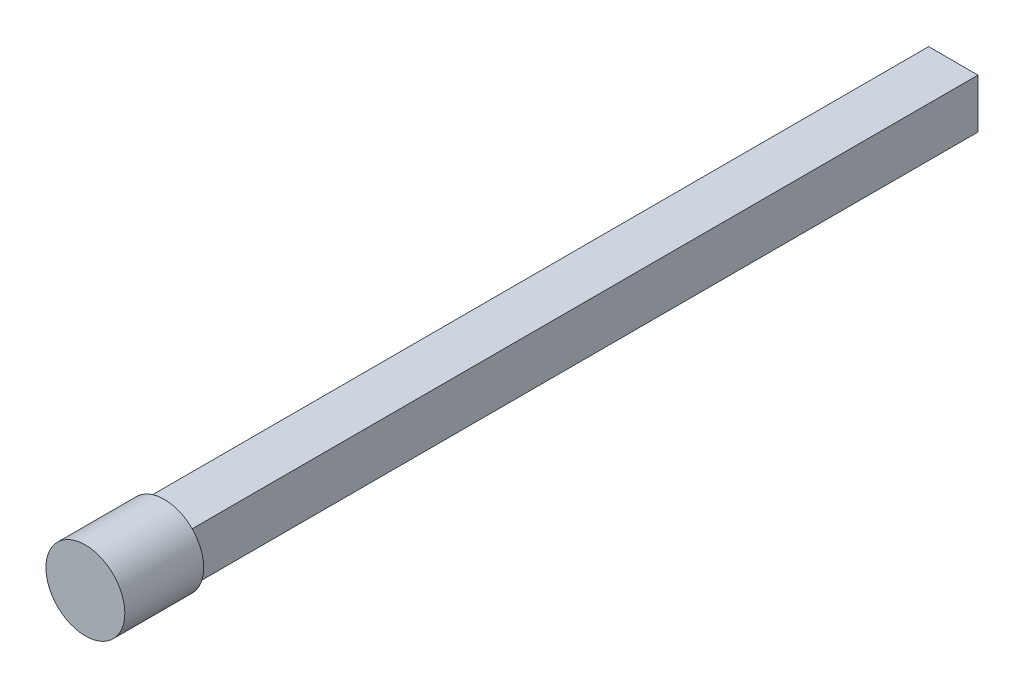
ISO-10303-21;
HEADER;
FILE_DESCRIPTION(('STEP AP214'),'2;1');
FILE_NAME('part.step','',(''),(''),'','','');
FILE_SCHEMA(('AUTOMOTIVE_DESIGN { 1 0 10303 214 1 1 1 1 }'));
ENDSEC;
DATA;
#1=APPLICATION_CONTEXT('core data for automotive mechanical design processes');
#2=APPLICATION_PROTOCOL_DEFINITION('international standard','automotive_design',2000,#1);
#3=PRODUCT_CONTEXT('',#1,'mechanical');
#4=PRODUCT('Part','Part','',(#3));
#5=PRODUCT_RELATED_PRODUCT_CATEGORY('part','',(#4));
#6=PRODUCT_DEFINITION_FORMATION('','',#4);
#7=PRODUCT_DEFINITION_CONTEXT('part definition',#1,'design');
#8=PRODUCT_DEFINITION('design','',#6,#7);
#9=PRODUCT_DEFINITION_SHAPE('','',#8);
#10=(LENGTH_UNIT() NAMED_UNIT(*) SI_UNIT(.MILLI.,.METRE.));
#11=(NAMED_UNIT(*) PLANE_ANGLE_UNIT() SI_UNIT($,.RADIAN.));
#12=(NAMED_UNIT(*) SI_UNIT($,.STERADIAN.) SOLID_ANGLE_UNIT());
#13=UNCERTAINTY_MEASURE_WITH_UNIT(LENGTH_MEASURE(1.E-05),#10,'distance_accuracy_value','');
#14=(GEOMETRIC_REPRESENTATION_CONTEXT(3) GLOBAL_UNCERTAINTY_ASSIGNED_CONTEXT((#13)) GLOBAL_UNIT_ASSIGNED_CONTEXT((#10,
#11,#12)) REPRESENTATION_CONTEXT('',''));
#15=CARTESIAN_POINT('',(0.,0.,0.));
#16=DIRECTION('',(0.,0.,1.));
#17=DIRECTION('',(1.,0.,0.));
#18=AXIS2_PLACEMENT_3D('',#15,#16,#17);
#19=CARTESIAN_POINT('',(2.5,-2.5,40.));
#20=DIRECTION('',(-1.,0.,0.));
#21=DIRECTION('',(0.,0.,1.));
#22=AXIS2_PLACEMENT_3D('',#19,#20,#21);
#23=PLANE('',#22);
#24=DIRECTION('',(0.,1.,0.));
#25=VECTOR('',#24,1.);
#26=CARTESIAN_POINT('',(2.5,-2.5,0.));
#27=LINE('',#26,#25);
#28=CARTESIAN_POINT('',(2.5,-2.5,0.));
#29=VERTEX_POINT('',#28);
#30=CARTESIAN_POINT('',(2.5,0.,0.));
#31=VERTEX_POINT('',#30);
#32=EDGE_CURVE('E115',#29,#31,#27,.T.);
#33=ORIENTED_EDGE('',*,*,#32,.T.);
#34=DIRECTION('',(0.,0.,-1.));
#35=VECTOR('',#34,1.);
#36=CARTESIAN_POINT('',(2.5,0.,40.));
#37=LINE('',#36,#35);
#38=CARTESIAN_POINT('',(2.5,0.,40.));
#39=VERTEX_POINT('',#38);
#40=EDGE_CURVE('E11',#39,#31,#37,.T.);
#41=ORIENTED_EDGE('',*,*,#40,.F.);
#42=DIRECTION('',(0.,1.,0.));
#43=VECTOR('',#42,1.);
#44=CARTESIAN_POINT('',(2.5,-2.5,40.));
#45=LINE('',#44,#43);
#46=CARTESIAN_POINT('',(2.5,-2.5,40.));
#47=VERTEX_POINT('',#46);
#48=EDGE_CURVE('E94',#47,#39,#45,.T.);
#49=ORIENTED_EDGE('',*,*,#48,.F.);
#50=DIRECTION('',(0.,0.,-1.));
#51=VECTOR('',#50,1.);
#52=CARTESIAN_POINT('',(2.5,-2.5,40.));
#53=LINE('',#52,#51);
#54=EDGE_CURVE('E96',#47,#29,#53,.T.);
#55=ORIENTED_EDGE('',*,*,#54,.T.);
#56=EDGE_LOOP('',(#33,#41,#49,#55));
#57=FACE_BOUND('',#56,.T.);
#58=ADVANCED_FACE('F45',(#57),#23,.F.);
#59=CARTESIAN_POINT('',(2.5,0.,40.));
#60=DIRECTION('',(0.,-1.,0.));
#61=DIRECTION('',(0.,0.,-1.));
#62=AXIS2_PLACEMENT_3D('',#59,#60,#61);
#63=PLANE('',#62);
#64=DIRECTION('',(-1.,0.,0.));
#65=VECTOR('',#64,1.);
#66=CARTESIAN_POINT('',(2.5,0.,0.));
#67=LINE('',#66,#65);
#68=CARTESIAN_POINT('',(0.,0.,0.));
#69=VERTEX_POINT('',#68);
#70=EDGE_CURVE('E118',#31,#69,#67,.T.);
#71=ORIENTED_EDGE('',*,*,#70,.T.);
#72=DIRECTION('',(0.,0.,-1.));
#73=VECTOR('',#72,1.);
#74=CARTESIAN_POINT('',(0.,0.,40.));
#75=LINE('',#74,#73);
#76=CARTESIAN_POINT('',(0.,0.,40.));
#77=VERTEX_POINT('',#76);
#78=EDGE_CURVE('E54',#77,#69,#75,.T.);
#79=ORIENTED_EDGE('',*,*,#78,.F.);
#80=DIRECTION('',(-1.,0.,0.));
#81=VECTOR('',#80,1.);
#82=CARTESIAN_POINT('',(2.5,0.,40.));
#83=LINE('',#82,#81);
#84=EDGE_CURVE('E88',#39,#77,#83,.T.);
#85=ORIENTED_EDGE('',*,*,#84,.F.);
#86=ORIENTED_EDGE('',*,*,#40,.T.);
#87=EDGE_LOOP('',(#71,#79,#85,#86));
#88=FACE_BOUND('',#87,.T.);
#89=ADVANCED_FACE('F131',(#88),#63,.F.);
#90=CARTESIAN_POINT('',(0.,-2.5,40.));
#91=DIRECTION('',(1.,0.,0.));
#92=DIRECTION('',(0.,0.,-1.));
#93=AXIS2_PLACEMENT_3D('',#90,#91,#92);
#94=PLANE('',#93);
#95=DIRECTION('',(0.,-1.,0.));
#96=VECTOR('',#95,1.);
#97=CARTESIAN_POINT('',(0.,-2.5,0.));
#98=LINE('',#97,#96);
#99=CARTESIAN_POINT('',(0.,-2.5,0.));
#100=VERTEX_POINT('',#99);
#101=EDGE_CURVE('E78',#69,#100,#98,.T.);
#102=ORIENTED_EDGE('',*,*,#101,.T.);
#103=DIRECTION('',(0.,0.,-1.));
#104=VECTOR('',#103,1.);
#105=CARTESIAN_POINT('',(0.,-2.5,40.));
#106=LINE('',#105,#104);
#107=CARTESIAN_POINT('',(0.,-2.5,40.));
#108=VERTEX_POINT('',#107);
#109=EDGE_CURVE('E62',#108,#100,#106,.T.);
#110=ORIENTED_EDGE('',*,*,#109,.F.);
#111=DIRECTION('',(0.,-1.,0.));
#112=VECTOR('',#111,1.);
#113=CARTESIAN_POINT('',(0.,-2.5,40.));
#114=LINE('',#113,#112);
#115=EDGE_CURVE('E108',#77,#108,#114,.T.);
#116=ORIENTED_EDGE('',*,*,#115,.F.);
#117=ORIENTED_EDGE('',*,*,#78,.T.);
#118=EDGE_LOOP('',(#102,#110,#116,#117));
#119=FACE_BOUND('',#118,.T.);
#120=ADVANCED_FACE('F128',(#119),#94,.F.);
#121=CARTESIAN_POINT('',(2.5,-2.5,40.));
#122=DIRECTION('',(0.,1.,0.));
#123=DIRECTION('',(-1.,0.,0.));
#124=AXIS2_PLACEMENT_3D('',#121,#122,#123);
#125=PLANE('',#124);
#126=DIRECTION('',(1.,0.,0.));
#127=VECTOR('',#126,1.);
#128=CARTESIAN_POINT('',(2.5,-2.5,0.));
#129=LINE('',#128,#127);
#130=EDGE_CURVE('E83',#100,#29,#129,.T.);
#131=ORIENTED_EDGE('',*,*,#130,.T.);
#132=ORIENTED_EDGE('',*,*,#54,.F.);
#133=DIRECTION('',(1.,0.,0.));
#134=VECTOR('',#133,1.);
#135=CARTESIAN_POINT('',(2.5,-2.5,40.));
#136=LINE('',#135,#134);
#137=EDGE_CURVE('E103',#108,#47,#136,.T.);
#138=ORIENTED_EDGE('',*,*,#137,.F.);
#139=ORIENTED_EDGE('',*,*,#109,.T.);
#140=EDGE_LOOP('',(#131,#132,#138,#139));
#141=FACE_BOUND('',#140,.T.);
#142=ADVANCED_FACE('F102',(#141),#125,.F.);
#143=CARTESIAN_POINT('',(0.,0.,0.));
#144=DIRECTION('',(0.,0.,1.));
#145=DIRECTION('',(1.,0.,0.));
#146=AXIS2_PLACEMENT_3D('',#143,#144,#145);
#147=PLANE('',#146);
#148=ORIENTED_EDGE('',*,*,#32,.F.);
#149=ORIENTED_EDGE('',*,*,#130,.F.);
#150=ORIENTED_EDGE('',*,*,#101,.F.);
#151=ORIENTED_EDGE('',*,*,#70,.F.);
#152=EDGE_LOOP('',(#148,#149,#150,#151));
#153=FACE_BOUND('',#152,.T.);
#154=ADVANCED_FACE('F130',(#153),#147,.F.);
#155=CARTESIAN_POINT('',(1.25,-1.25,40.));
#156=DIRECTION('',(0.,0.,1.));
#157=DIRECTION('',(1.,0.,0.));
#158=AXIS2_PLACEMENT_3D('',#155,#156,#157);
#159=PLANE('',#158);
#160=CARTESIAN_POINT('',(1.25,-1.25,40.));
#161=DIRECTION('',(0.,0.,1.));
#162=DIRECTION('',(1.,0.,0.));
#163=AXIS2_PLACEMENT_3D('',#160,#161,#162);
#164=CIRCLE('',#163,2.);
#165=CARTESIAN_POINT('',(3.25,-1.25,40.));
#166=VERTEX_POINT('',#165);
#167=EDGE_CURVE('E158',#166,#166,#164,.T.);
#168=ORIENTED_EDGE('',*,*,#167,.F.);
#169=EDGE_LOOP('',(#168));
#170=FACE_BOUND('',#169,.T.);
#171=ORIENTED_EDGE('',*,*,#137,.T.);
#172=ORIENTED_EDGE('',*,*,#48,.T.);
#173=ORIENTED_EDGE('',*,*,#84,.T.);
#174=ORIENTED_EDGE('',*,*,#115,.T.);
#175=EDGE_LOOP('',(#171,#172,#173,#174));
#176=FACE_BOUND('',#175,.T.);
#177=ADVANCED_FACE('F107',(#170,#176),#159,.F.);
#178=CARTESIAN_POINT('',(1.25,-1.25,44.));
#179=DIRECTION('',(0.,0.,-1.));
#180=DIRECTION('',(-1.,0.,0.));
#181=AXIS2_PLACEMENT_3D('',#178,#179,#180);
#182=CYLINDRICAL_SURFACE('',#181,2.);
#183=CARTESIAN_POINT('',(1.25,-1.25,44.));
#184=DIRECTION('',(0.,0.,1.));
#185=DIRECTION('',(1.,0.,0.));
#186=AXIS2_PLACEMENT_3D('',#183,#184,#185);
#187=CIRCLE('',#186,2.);
#188=CARTESIAN_POINT('',(3.25,-1.25,44.));
#189=VERTEX_POINT('',#188);
#190=EDGE_CURVE('E119',#189,#189,#187,.T.);
#191=ORIENTED_EDGE('',*,*,#190,.F.);
#192=EDGE_LOOP('',(#191));
#193=FACE_BOUND('',#192,.T.);
#194=ORIENTED_EDGE('',*,*,#167,.T.);
#195=EDGE_LOOP('',(#194));
#196=FACE_BOUND('',#195,.T.);
#197=ADVANCED_FACE('F143',(#193,#196),#182,.T.);
#198=CARTESIAN_POINT('',(1.25,-1.25,44.));
#199=DIRECTION('',(0.,0.,1.));
#200=DIRECTION('',(1.,0.,0.));
#201=AXIS2_PLACEMENT_3D('',#198,#199,#200);
#202=PLANE('',#201);
#203=ORIENTED_EDGE('',*,*,#190,.T.);
#204=EDGE_LOOP('',(#203));
#205=FACE_BOUND('',#204,.T.);
#206=ADVANCED_FACE('F146',(#205),#202,.T.);
#207=CLOSED_SHELL('',(#58,#89,#120,#142,#154,#177,#197,#206));
#208=MANIFOLD_SOLID_BREP('B2',#207);
#209=ADVANCED_BREP_SHAPE_REPRESENTATION('',(#18,#208),#14);
#210=SHAPE_DEFINITION_REPRESENTATION(#9,#209);
ENDSEC;
END-ISO-10303-21;
